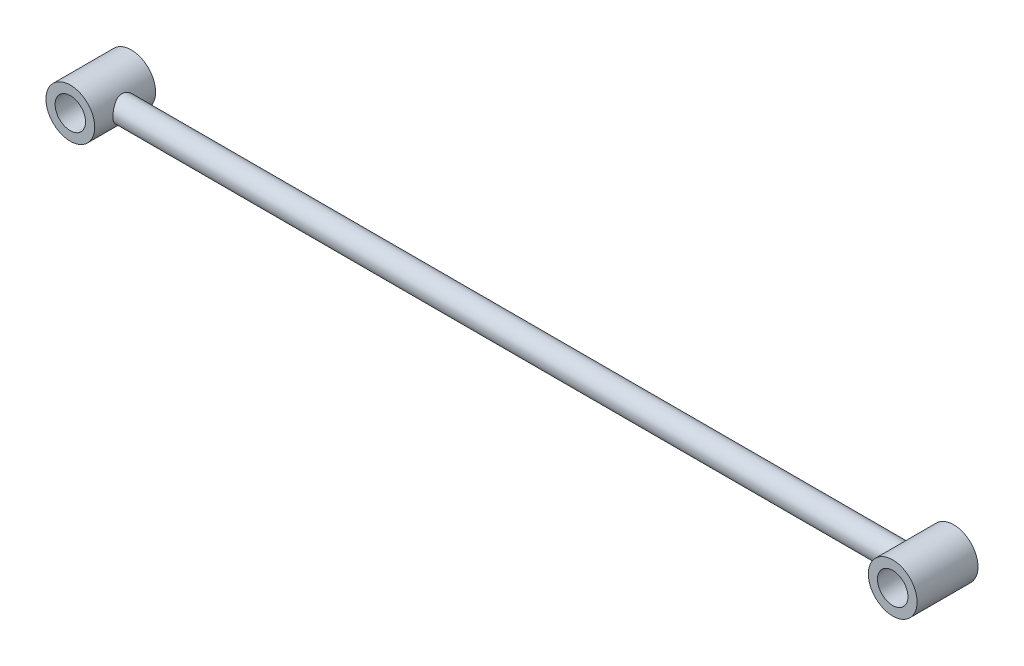
ISO-10303-21;
HEADER;
FILE_DESCRIPTION(('STEP AP214'),'2;1');
FILE_NAME('part.step','',(''),(''),'','','');
FILE_SCHEMA(('AUTOMOTIVE_DESIGN { 1 0 10303 214 1 1 1 1 }'));
ENDSEC;
DATA;
#1=APPLICATION_CONTEXT('core data for automotive mechanical design processes');
#2=APPLICATION_PROTOCOL_DEFINITION('international standard','automotive_design',2000,#1);
#3=PRODUCT_CONTEXT('',#1,'mechanical');
#4=PRODUCT('Part','Part','',(#3));
#5=PRODUCT_RELATED_PRODUCT_CATEGORY('part','',(#4));
#6=PRODUCT_DEFINITION_FORMATION('','',#4);
#7=PRODUCT_DEFINITION_CONTEXT('part definition',#1,'design');
#8=PRODUCT_DEFINITION('design','',#6,#7);
#9=PRODUCT_DEFINITION_SHAPE('','',#8);
#10=(LENGTH_UNIT() NAMED_UNIT(*) SI_UNIT(.MILLI.,.METRE.));
#11=(NAMED_UNIT(*) PLANE_ANGLE_UNIT() SI_UNIT($,.RADIAN.));
#12=(NAMED_UNIT(*) SI_UNIT($,.STERADIAN.) SOLID_ANGLE_UNIT());
#13=UNCERTAINTY_MEASURE_WITH_UNIT(LENGTH_MEASURE(1.E-05),#10,'distance_accuracy_value','');
#14=(GEOMETRIC_REPRESENTATION_CONTEXT(3) GLOBAL_UNCERTAINTY_ASSIGNED_CONTEXT((#13)) GLOBAL_UNIT_ASSIGNED_CONTEXT((#10,
#11,#12)) REPRESENTATION_CONTEXT('',''));
#15=CARTESIAN_POINT('',(0.,0.,0.));
#16=DIRECTION('',(0.,0.,1.));
#17=DIRECTION('',(1.,0.,0.));
#18=AXIS2_PLACEMENT_3D('',#15,#16,#17);
#19=CARTESIAN_POINT('',(0.,0.,-2.5));
#20=DIRECTION('',(0.,0.,1.));
#21=DIRECTION('',(1.,0.,0.));
#22=AXIS2_PLACEMENT_3D('',#19,#20,#21);
#23=CYLINDRICAL_SURFACE('',#22,2.);
#24=CARTESIAN_POINT('',(0.,0.,-2.5));
#25=DIRECTION('',(0.,0.,1.));
#26=DIRECTION('',(1.,0.,0.));
#27=AXIS2_PLACEMENT_3D('',#24,#25,#26);
#28=CIRCLE('',#27,2.);
#29=CARTESIAN_POINT('',(2.,0.,-2.5));
#30=VERTEX_POINT('',#29);
#31=EDGE_CURVE('E52',#30,#30,#28,.T.);
#32=ORIENTED_EDGE('',*,*,#31,.T.);
#33=EDGE_LOOP('',(#32));
#34=FACE_BOUND('',#33,.T.);
#35=CARTESIAN_POINT('',(0.,0.,2.5));
#36=DIRECTION('',(0.,0.,1.));
#37=DIRECTION('',(1.,0.,0.));
#38=AXIS2_PLACEMENT_3D('',#35,#36,#37);
#39=CIRCLE('',#38,2.);
#40=CARTESIAN_POINT('',(2.,0.,2.5));
#41=VERTEX_POINT('',#40);
#42=EDGE_CURVE('E93',#41,#41,#39,.T.);
#43=ORIENTED_EDGE('',*,*,#42,.F.);
#44=EDGE_LOOP('',(#43));
#45=FACE_BOUND('',#44,.T.);
#46=CARTESIAN_POINT('',(2.,0.,-0.999999999999989));
#47=CARTESIAN_POINT('',(1.99999713404151,-0.052571962952986,-0.999996697680488));
#48=CARTESIAN_POINT('',(1.99790491019518,-0.105206599698032,-0.995829926878314));
#49=CARTESIAN_POINT('',(1.98974156037396,-0.208920235268423,-0.979347119659071));
#50=CARTESIAN_POINT('',(1.98366287828984,-0.259996086713501,-0.967015607002339));
#51=CARTESIAN_POINT('',(1.96816279403312,-0.358933544880571,-0.934806191383195));
#52=CARTESIAN_POINT('',(1.9587543917752,-0.406806802939176,-0.914957615751977));
#53=CARTESIAN_POINT('',(1.93745776515779,-0.49847261680656,-0.868429378635049));
#54=CARTESIAN_POINT('',(1.9255697363353,-0.542265493990045,-0.841750255751138));
#55=CARTESIAN_POINT('',(1.89956258258057,-0.627507817761913,-0.780482750514692));
#56=CARTESIAN_POINT('',(1.88535199127536,-0.668655211122105,-0.745513520760349));
#57=CARTESIAN_POINT('',(1.85659970246745,-0.74477944486697,-0.669478520752958));
#58=CARTESIAN_POINT('',(1.84205776209035,-0.779751583106759,-0.628408148227551));
#59=CARTESIAN_POINT('',(1.81298951197347,-0.84525200045027,-0.53751665047661));
#60=CARTESIAN_POINT('',(1.79855186970132,-0.875225335551628,-0.48726390165408));
#61=CARTESIAN_POINT('',(1.77285978772321,-0.926168226890685,-0.38163266401378));
#62=CARTESIAN_POINT('',(1.7616030760699,-0.947144214966323,-0.326257871277246));
#63=CARTESIAN_POINT('',(1.74457867037809,-0.978132442188578,-0.215334894578074));
#64=CARTESIAN_POINT('',(1.73852271583714,-0.98872585708043,-0.159995547932603));
#65=CARTESIAN_POINT('',(1.73181889948528,-1.00042699330883,-0.0480211622205215));
#66=CARTESIAN_POINT('',(1.73116569343289,-1.00154408837306,0.00861254087115569));
#67=CARTESIAN_POINT('',(1.73510930257249,-0.994687287172283,0.114286024315368));
#68=CARTESIAN_POINT('',(1.73908763662014,-0.98778455953681,0.16342403122305));
#69=CARTESIAN_POINT('',(1.75076228733851,-0.966939849056921,0.259721909373041));
#70=CARTESIAN_POINT('',(1.75845978831777,-0.95299562389764,0.306881145305314));
#71=CARTESIAN_POINT('',(1.77687476412742,-0.918209780385993,0.399229132565657));
#72=CARTESIAN_POINT('',(1.78765840663999,-0.897215067115984,0.444346398785786));
#73=CARTESIAN_POINT('',(1.81103404281404,-0.849041687667991,0.530634292590004));
#74=CARTESIAN_POINT('',(1.82362684780191,-0.821860243812457,0.571803135600085));
#75=CARTESIAN_POINT('',(1.85113157903286,-0.758066054912778,0.654521252743221));
#76=CARTESIAN_POINT('',(1.86613510236747,-0.720694458369271,0.695456873576152));
#77=CARTESIAN_POINT('',(1.89547623300408,-0.639555578741363,0.770735418590895));
#78=CARTESIAN_POINT('',(1.90981351958801,-0.595785256574276,0.805075192033876));
#79=CARTESIAN_POINT('',(1.93701987282964,-0.50051650583184,0.867685661029719));
#80=CARTESIAN_POINT('',(1.94978984162008,-0.4487535915994,0.895600472445732));
#81=CARTESIAN_POINT('',(1.97157881121242,-0.34046621548879,0.942097029043));
#82=CARTESIAN_POINT('',(1.98060078943553,-0.28394557626527,0.960686185015157));
#83=CARTESIAN_POINT('',(1.99324333741436,-0.172766491660697,0.986475403716665));
#84=CARTESIAN_POINT('',(1.99724938301312,-0.11834153054832,0.994491235746767));
#85=CARTESIAN_POINT('',(2.00073013459102,-0.0087795999493507,1.00146473113448));
#86=CARTESIAN_POINT('',(2.00020698721312,0.0463570198699037,1.00042668563947));
#87=CARTESIAN_POINT('',(1.99491192253441,0.151232971985995,0.989793311581235));
#88=CARTESIAN_POINT('',(1.9904724568819,0.201059408049955,0.980867467269958));
#89=CARTESIAN_POINT('',(1.97822171314819,0.298406892301917,0.955761928104903));
#90=CARTESIAN_POINT('',(1.97041006334332,0.345927685690996,0.939581433546629));
#91=CARTESIAN_POINT('',(1.95184251413669,0.438888608449663,0.900001533566816));
#92=CARTESIAN_POINT('',(1.94100881769939,0.484230397006151,0.876408949883176));
#93=CARTESIAN_POINT('',(1.91743974317109,0.570461361698918,0.822892464353947));
#94=CARTESIAN_POINT('',(1.90470355565785,0.611348629775278,0.792965865406557));
#95=CARTESIAN_POINT('',(1.87708221337465,0.691767689290648,0.724239574667115));
#96=CARTESIAN_POINT('',(1.86210884848442,0.730772077824633,0.684857131546424));
#97=CARTESIAN_POINT('',(1.83262391603875,0.801856321113233,0.600074848730686));
#98=CARTESIAN_POINT('',(1.81811267381527,0.833931385690834,0.554670881183616));
#99=CARTESIAN_POINT('',(1.79051192226068,0.891707914497688,0.456356345799679));
#100=CARTESIAN_POINT('',(1.77752529663472,0.917025495878629,0.403188733791397));
#101=CARTESIAN_POINT('',(1.75574072368127,0.958082826013793,0.292489932307471));
#102=CARTESIAN_POINT('',(1.74693738240619,0.97383491588756,0.234964473498806));
#103=CARTESIAN_POINT('',(1.73561501008667,0.993861687449668,0.123089777138547));
#104=CARTESIAN_POINT('',(1.73257383460492,0.999092996400854,0.0689657465709596));
#105=CARTESIAN_POINT('',(1.73165354646176,1.00068915438078,-0.0394470671707315));
#106=CARTESIAN_POINT('',(1.73377219627553,0.997057846624387,-0.0937357687394361));
#107=CARTESIAN_POINT('',(1.74237862050025,0.981926125592251,-0.195483501532017));
#108=CARTESIAN_POINT('',(1.74843094482394,0.971208314342788,-0.243100470144401));
#109=CARTESIAN_POINT('',(1.76371016187918,0.943175358224633,-0.335808119424706));
#110=CARTESIAN_POINT('',(1.77293807569676,0.925858091159798,-0.380897982091967));
#111=CARTESIAN_POINT('',(1.79428530364529,0.883815745300671,-0.470624850986605));
#112=CARTESIAN_POINT('',(1.80655722396191,0.858671137816446,-0.515027901829699));
#113=CARTESIAN_POINT('',(1.83235331634591,0.802150971636622,-0.599274536180583));
#114=CARTESIAN_POINT('',(1.84587813794523,0.770772171238636,-0.639115730518487));
#115=CARTESIAN_POINT('',(1.87462323159313,0.698203326664629,-0.718141982357612));
#116=CARTESIAN_POINT('',(1.88984983311469,0.656284423010159,-0.756659102361917));
#117=CARTESIAN_POINT('',(1.91877752255088,0.566154806220268,-0.826262983423627));
#118=CARTESIAN_POINT('',(1.9324777860804,0.517940723256774,-0.857345739426283));
#119=CARTESIAN_POINT('',(1.95698009585103,0.415931596819936,-0.911236362762197));
#120=CARTESIAN_POINT('',(1.96776096562909,0.362099503934604,-0.933984169411426));
#121=CARTESIAN_POINT('',(1.98501341363466,0.250742101294182,-0.969808167918943));
#122=CARTESIAN_POINT('',(1.99149723372932,0.193227799623158,-0.982911846829568));
#123=CARTESIAN_POINT('',(1.99695461909663,0.112601946483377,-0.993897411075839));
#124=CARTESIAN_POINT('',(1.99809365339202,0.0901618794394935,-0.996182640863608));
#125=CARTESIAN_POINT('',(1.99961696977865,0.0451517318071549,-0.999234665516795));
#126=CARTESIAN_POINT('',(2.00000123103763,0.02258164764738,-1.00000141847119));
#127=CARTESIAN_POINT('',(2.,0.,-0.999999999999989));
#128=B_SPLINE_CURVE_WITH_KNOTS('',3,(#46,#47,#48,#49,#50,#51,#52,#53,#54,#55,#56,#57,#58,#59,
#60,#61,#62,#63,#64,#65,#66,#67,#68,#69,#70,#71,#72,#73,#74,#75,#76,#77,#78,#79,#80,#81,#82,#83,
#84,#85,#86,#87,#88,#89,#90,#91,#92,#93,#94,#95,#96,#97,#98,#99,#100,#101,#102,#103,#104,#105,
#106,#107,#108,#109,#110,#111,#112,#113,#114,#115,#116,#117,#118,#119,#120,#121,#122,#123,#124,
#125,#126,#127),.UNSPECIFIED.,.T.,.F.,(4,2,2,2,2,2,2,2,2,2,2,2,2,2,2,2,2,2,2,2,2,2,2,2,2,2,2,2,
2,2,2,2,2,2,2,2,2,2,2,2,4),(0.,0.157624257420291,0.315548149709194,0.472862155492294,
0.630163760581561,0.796981758718081,0.963926237654025,1.14381726430751,1.32357947898279,
1.49258012140228,1.66141357329019,1.81005712409319,1.95874803925676,2.11090240168485,
2.26312521260219,2.43464941333876,2.60625534598684,2.78583022214438,2.96526216912276,
3.12983290471342,3.29432564511472,3.44606906506118,3.59782921630928,3.75392856027895,
3.91009450748335,4.08159610644414,4.25321588615427,4.43314682159669,4.61284511940773,
4.77529307498368,4.9376705986,5.08457930244177,5.23153528783673,5.38836456775608,
5.54527561138952,5.72125242752492,5.89732383376567,6.07464013662919,6.25144908624923,
6.31915280137691,6.38685838514839),.UNSPECIFIED.);
#129=CARTESIAN_POINT('',(2.,0.,-0.999999999999989));
#130=VERTEX_POINT('',#129);
#131=EDGE_CURVE('E48',#130,#130,#128,.T.);
#132=ORIENTED_EDGE('',*,*,#131,.T.);
#133=EDGE_LOOP('',(#132));
#134=FACE_BOUND('',#133,.T.);
#135=ADVANCED_FACE('F36',(#34,#45,#134),#23,.T.);
#136=CARTESIAN_POINT('',(0.,0.,-2.5));
#137=DIRECTION('',(0.,0.,1.));
#138=DIRECTION('',(1.,0.,0.));
#139=AXIS2_PLACEMENT_3D('',#136,#137,#138);
#140=PLANE('',#139);
#141=CARTESIAN_POINT('',(0.,0.,-2.5));
#142=DIRECTION('',(0.,0.,1.));
#143=DIRECTION('',(1.,0.,0.));
#144=AXIS2_PLACEMENT_3D('',#141,#142,#143);
#145=CIRCLE('',#144,1.25);
#146=CARTESIAN_POINT('',(1.25,0.,-2.5));
#147=VERTEX_POINT('',#146);
#148=EDGE_CURVE('E56',#147,#147,#145,.T.);
#149=ORIENTED_EDGE('',*,*,#148,.T.);
#150=EDGE_LOOP('',(#149));
#151=FACE_BOUND('',#150,.T.);
#152=ORIENTED_EDGE('',*,*,#31,.F.);
#153=EDGE_LOOP('',(#152));
#154=FACE_BOUND('',#153,.T.);
#155=ADVANCED_FACE('F78',(#151,#154),#140,.F.);
#156=CARTESIAN_POINT('',(0.,0.,-2.5));
#157=DIRECTION('',(0.,0.,1.));
#158=DIRECTION('',(1.,0.,0.));
#159=AXIS2_PLACEMENT_3D('',#156,#157,#158);
#160=CYLINDRICAL_SURFACE('',#159,1.25);
#161=ORIENTED_EDGE('',*,*,#148,.F.);
#162=EDGE_LOOP('',(#161));
#163=FACE_BOUND('',#162,.T.);
#164=CARTESIAN_POINT('',(0.,0.,2.5));
#165=DIRECTION('',(0.,0.,1.));
#166=DIRECTION('',(1.,0.,0.));
#167=AXIS2_PLACEMENT_3D('',#164,#165,#166);
#168=CIRCLE('',#167,1.25);
#169=CARTESIAN_POINT('',(1.25,0.,2.5));
#170=VERTEX_POINT('',#169);
#171=EDGE_CURVE('E94',#170,#170,#168,.T.);
#172=ORIENTED_EDGE('',*,*,#171,.T.);
#173=EDGE_LOOP('',(#172));
#174=FACE_BOUND('',#173,.T.);
#175=ADVANCED_FACE('F75',(#163,#174),#160,.F.);
#176=CARTESIAN_POINT('',(0.,0.,2.5));
#177=DIRECTION('',(0.,0.,1.));
#178=DIRECTION('',(1.,0.,0.));
#179=AXIS2_PLACEMENT_3D('',#176,#177,#178);
#180=PLANE('',#179);
#181=ORIENTED_EDGE('',*,*,#42,.T.);
#182=EDGE_LOOP('',(#181));
#183=FACE_BOUND('',#182,.T.);
#184=ORIENTED_EDGE('',*,*,#171,.F.);
#185=EDGE_LOOP('',(#184));
#186=FACE_BOUND('',#185,.T.);
#187=ADVANCED_FACE('F68',(#183,#186),#180,.T.);
#188=CARTESIAN_POINT('',(2.,0.,0.));
#189=DIRECTION('',(-1.,0.,0.));
#190=DIRECTION('',(0.,0.,1.));
#191=AXIS2_PLACEMENT_3D('',#188,#189,#190);
#192=CYLINDRICAL_SURFACE('',#191,0.999999999999989);
#193=ORIENTED_EDGE('',*,*,#131,.F.);
#194=EDGE_LOOP('',(#193));
#195=FACE_BOUND('',#194,.T.);
#196=CARTESIAN_POINT('',(65.5,0.,0.999999999999989));
#197=CARTESIAN_POINT('',(65.5000028659585,0.0525719629529861,0.999996697680488));
#198=CARTESIAN_POINT('',(65.5020950898048,0.105206599698032,0.995829926878314));
#199=CARTESIAN_POINT('',(65.5102584396261,0.208920235268423,0.979347119659072));
#200=CARTESIAN_POINT('',(65.5163371217102,0.259996086713501,0.967015607002339));
#201=CARTESIAN_POINT('',(65.5318372059669,0.358933544880571,0.934806191383195));
#202=CARTESIAN_POINT('',(65.5412456082248,0.406806802939177,0.914957615751977));
#203=CARTESIAN_POINT('',(65.5625422348422,0.498472616806561,0.868429378635048));
#204=CARTESIAN_POINT('',(65.5744302636647,0.542265493990045,0.841750255751137));
#205=CARTESIAN_POINT('',(65.6004374174194,0.627507817761913,0.780482750514691));
#206=CARTESIAN_POINT('',(65.6146480087246,0.668655211122106,0.745513520760348));
#207=CARTESIAN_POINT('',(65.6434002975326,0.744779444866971,0.669478520752958));
#208=CARTESIAN_POINT('',(65.6579422379097,0.779751583106759,0.628408148227551));
#209=CARTESIAN_POINT('',(65.6870104880265,0.845252000450269,0.537516650476611));
#210=CARTESIAN_POINT('',(65.7014481302987,0.875225335551627,0.487263901654082));
#211=CARTESIAN_POINT('',(65.7271402122768,0.926168226890685,0.381632664013781));
#212=CARTESIAN_POINT('',(65.7383969239301,0.947144214966323,0.326257871277247));
#213=CARTESIAN_POINT('',(65.7554213296219,0.978132442188578,0.215334894578074));
#214=CARTESIAN_POINT('',(65.7614772841629,0.98872585708043,0.159995547932603));
#215=CARTESIAN_POINT('',(65.7681811005147,1.00042699330883,0.048021162220521));
#216=CARTESIAN_POINT('',(65.7688343065671,1.00154408837306,-0.008612540871157));
#217=CARTESIAN_POINT('',(65.7648906974275,0.994687287172283,-0.11428602431537));
#218=CARTESIAN_POINT('',(65.7609123633799,0.98778455953681,-0.163424031223051));
#219=CARTESIAN_POINT('',(65.7492377126615,0.966939849056921,-0.259721909373041));
#220=CARTESIAN_POINT('',(65.7415402116822,0.952995623897641,-0.306881145305314));
#221=CARTESIAN_POINT('',(65.7231252358726,0.918209780385993,-0.399229132565657));
#222=CARTESIAN_POINT('',(65.71234159336,0.897215067115983,-0.444346398785787));
#223=CARTESIAN_POINT('',(65.688965957186,0.84904168766799,-0.530634292590007));
#224=CARTESIAN_POINT('',(65.6763731521981,0.821860243812455,-0.571803135600087));
#225=CARTESIAN_POINT('',(65.6488684209671,0.758066054912776,-0.654521252743223));
#226=CARTESIAN_POINT('',(65.6338648976325,0.720694458369269,-0.695456873576154));
#227=CARTESIAN_POINT('',(65.6045237669959,0.639555578741362,-0.770735418590896));
#228=CARTESIAN_POINT('',(65.590186480412,0.595785256574276,-0.805075192033876));
#229=CARTESIAN_POINT('',(65.5629801271704,0.50051650583184,-0.867685661029719));
#230=CARTESIAN_POINT('',(65.5502101583799,0.448753591599401,-0.895600472445731));
#231=CARTESIAN_POINT('',(65.5284211887876,0.34046621548879,-0.942097029042999));
#232=CARTESIAN_POINT('',(65.5193992105645,0.283945576265271,-0.960686185015157));
#233=CARTESIAN_POINT('',(65.5067566625856,0.172766491660699,-0.986475403716665));
#234=CARTESIAN_POINT('',(65.5027506169869,0.118341530548321,-0.994491235746768));
#235=CARTESIAN_POINT('',(65.499269865409,0.00877959994935099,-1.00146473113448));
#236=CARTESIAN_POINT('',(65.4997930127869,-0.0463570198699039,-1.00042668563947));
#237=CARTESIAN_POINT('',(65.5050880774656,-0.151232971985995,-0.989793311581234));
#238=CARTESIAN_POINT('',(65.5095275431181,-0.201059408049955,-0.980867467269958));
#239=CARTESIAN_POINT('',(65.5217782868518,-0.298406892301916,-0.955761928104903));
#240=CARTESIAN_POINT('',(65.5295899366567,-0.345927685690996,-0.939581433546629));
#241=CARTESIAN_POINT('',(65.5481574858633,-0.438888608449664,-0.900001533566816));
#242=CARTESIAN_POINT('',(65.5589911823006,-0.484230397006151,-0.876408949883176));
#243=CARTESIAN_POINT('',(65.5825602568289,-0.570461361698917,-0.822892464353947));
#244=CARTESIAN_POINT('',(65.5952964443422,-0.611348629775278,-0.792965865406557));
#245=CARTESIAN_POINT('',(65.6229177866254,-0.69176768929065,-0.724239574667114));
#246=CARTESIAN_POINT('',(65.6378911515156,-0.730772077824637,-0.684857131546421));
#247=CARTESIAN_POINT('',(65.6673760839613,-0.801856321113235,-0.600074848730683));
#248=CARTESIAN_POINT('',(65.6818873261847,-0.833931385690834,-0.554670881183616));
#249=CARTESIAN_POINT('',(65.7094880777393,-0.891707914497687,-0.456356345799681));
#250=CARTESIAN_POINT('',(65.7224747033653,-0.917025495878629,-0.403188733791397));
#251=CARTESIAN_POINT('',(65.7442592763187,-0.958082826013793,-0.292489932307471));
#252=CARTESIAN_POINT('',(65.7530626175938,-0.97383491588756,-0.234964473498806));
#253=CARTESIAN_POINT('',(65.7643849899133,-0.993861687449668,-0.123089777138547));
#254=CARTESIAN_POINT('',(65.7674261653951,-0.999092996400854,-0.0689657465709599));
#255=CARTESIAN_POINT('',(65.7683464535383,-1.00068915438078,0.0394470671707311));
#256=CARTESIAN_POINT('',(65.7662278037245,-0.997057846624387,0.0937357687394356));
#257=CARTESIAN_POINT('',(65.7576213794998,-0.981926125592251,0.195483501532015));
#258=CARTESIAN_POINT('',(65.7515690551761,-0.971208314342788,0.243100470144399));
#259=CARTESIAN_POINT('',(65.7362898381208,-0.943175358224634,0.335808119424704));
#260=CARTESIAN_POINT('',(65.7270619243032,-0.925858091159798,0.380897982091966));
#261=CARTESIAN_POINT('',(65.7057146963547,-0.883815745300671,0.470624850986605));
#262=CARTESIAN_POINT('',(65.6934427760381,-0.858671137816448,0.515027901829697));
#263=CARTESIAN_POINT('',(65.6676466836541,-0.802150971636624,0.599274536180581));
#264=CARTESIAN_POINT('',(65.6541218620548,-0.770772171238636,0.639115730518487));
#265=CARTESIAN_POINT('',(65.6253767684069,-0.698203326664629,0.718141982357612));
#266=CARTESIAN_POINT('',(65.6101501668853,-0.656284423010161,0.756659102361916));
#267=CARTESIAN_POINT('',(65.5812224774491,-0.56615480622027,0.826262983423625));
#268=CARTESIAN_POINT('',(65.5675222139196,-0.517940723256775,0.857345739426282));
#269=CARTESIAN_POINT('',(65.543019904149,-0.415931596819939,0.911236362762196));
#270=CARTESIAN_POINT('',(65.5322390343709,-0.362099503934608,0.933984169411425));
#271=CARTESIAN_POINT('',(65.5149865863653,-0.250742101294187,0.969808167918941));
#272=CARTESIAN_POINT('',(65.5085027662707,-0.193227799623161,0.982911846829568));
#273=CARTESIAN_POINT('',(65.5030453809034,-0.112601946483379,0.993897411075839));
#274=CARTESIAN_POINT('',(65.501906346608,-0.0901618794394948,0.996182640863608));
#275=CARTESIAN_POINT('',(65.5003830302214,-0.0451517318071554,0.999234665516795));
#276=CARTESIAN_POINT('',(65.4999987689624,-0.0225816476473803,1.00000141847119));
#277=CARTESIAN_POINT('',(65.5,0.,0.999999999999989));
#278=B_SPLINE_CURVE_WITH_KNOTS('',3,(#196,#197,#198,#199,#200,#201,#202,#203,#204,#205,#206,
#207,#208,#209,#210,#211,#212,#213,#214,#215,#216,#217,#218,#219,#220,#221,#222,#223,#224,#225,
#226,#227,#228,#229,#230,#231,#232,#233,#234,#235,#236,#237,#238,#239,#240,#241,#242,#243,#244,
#245,#246,#247,#248,#249,#250,#251,#252,#253,#254,#255,#256,#257,#258,#259,#260,#261,#262,#263,
#264,#265,#266,#267,#268,#269,#270,#271,#272,#273,#274,#275,#276,#277),.UNSPECIFIED.,.T.,.F.,(4,
2,2,2,2,2,2,2,2,2,2,2,2,2,2,2,2,2,2,2,2,2,2,2,2,2,2,2,2,2,2,2,2,2,2,2,2,2,2,2,4),(0.,
0.157624257420292,0.315548149709194,0.472862155492295,0.630163760581562,0.796981758718082,
0.963926237654025,1.14381726430751,1.32357947898279,1.49258012140228,1.66141357329019,
1.81005712409319,1.95874803925676,2.11090240168485,2.2631252126022,2.43464941333876,
2.60625534598683,2.78583022214438,2.96526216912276,3.12983290471342,3.29432564511473,
3.44606906506118,3.59782921630928,3.75392856027895,3.91009450748335,4.08159610644415,
4.25321588615427,4.43314682159669,4.61284511940773,4.77529307498368,4.9376705986,
5.08457930244177,5.23153528783672,5.38836456775608,5.54527561138952,5.72125242752493,
5.89732383376566,6.07464013662918,6.25144908624923,6.31915280137691,6.3868583851484),.UNSPECIFIED.);
#279=CARTESIAN_POINT('',(65.5,0.,0.999999999999989));
#280=VERTEX_POINT('',#279);
#281=EDGE_CURVE('E10',#280,#280,#278,.T.);
#282=ORIENTED_EDGE('',*,*,#281,.T.);
#283=EDGE_LOOP('',(#282));
#284=FACE_BOUND('',#283,.T.);
#285=ADVANCED_FACE('F62',(#195,#284),#192,.T.);
#286=CARTESIAN_POINT('',(67.5,0.,-2.5));
#287=DIRECTION('',(0.,0.,1.));
#288=DIRECTION('',(1.,0.,0.));
#289=AXIS2_PLACEMENT_3D('',#286,#287,#288);
#290=CYLINDRICAL_SURFACE('',#289,2.);
#291=CARTESIAN_POINT('',(67.5,0.,2.5));
#292=DIRECTION('',(0.,0.,1.));
#293=DIRECTION('',(1.,0.,0.));
#294=AXIS2_PLACEMENT_3D('',#291,#292,#293);
#295=CIRCLE('',#294,2.);
#296=CARTESIAN_POINT('',(69.5,0.,2.5));
#297=VERTEX_POINT('',#296);
#298=EDGE_CURVE('E102',#297,#297,#295,.T.);
#299=ORIENTED_EDGE('',*,*,#298,.F.);
#300=EDGE_LOOP('',(#299));
#301=FACE_BOUND('',#300,.T.);
#302=CARTESIAN_POINT('',(67.5,0.,-2.5));
#303=DIRECTION('',(0.,0.,1.));
#304=DIRECTION('',(1.,0.,0.));
#305=AXIS2_PLACEMENT_3D('',#302,#303,#304);
#306=CIRCLE('',#305,2.);
#307=CARTESIAN_POINT('',(69.5,0.,-2.5));
#308=VERTEX_POINT('',#307);
#309=EDGE_CURVE('E108',#308,#308,#306,.T.);
#310=ORIENTED_EDGE('',*,*,#309,.T.);
#311=EDGE_LOOP('',(#310));
#312=FACE_BOUND('',#311,.T.);
#313=ORIENTED_EDGE('',*,*,#281,.F.);
#314=EDGE_LOOP('',(#313));
#315=FACE_BOUND('',#314,.T.);
#316=ADVANCED_FACE('F67',(#301,#312,#315),#290,.T.);
#317=CARTESIAN_POINT('',(67.5,0.,-2.5));
#318=DIRECTION('',(0.,0.,1.));
#319=DIRECTION('',(1.,0.,0.));
#320=AXIS2_PLACEMENT_3D('',#317,#318,#319);
#321=PLANE('',#320);
#322=CARTESIAN_POINT('',(67.5,0.,-2.5));
#323=DIRECTION('',(0.,0.,1.));
#324=DIRECTION('',(1.,0.,0.));
#325=AXIS2_PLACEMENT_3D('',#322,#323,#324);
#326=CIRCLE('',#325,1.25);
#327=CARTESIAN_POINT('',(68.75,0.,-2.5));
#328=VERTEX_POINT('',#327);
#329=EDGE_CURVE('E105',#328,#328,#326,.T.);
#330=ORIENTED_EDGE('',*,*,#329,.T.);
#331=EDGE_LOOP('',(#330));
#332=FACE_BOUND('',#331,.T.);
#333=ORIENTED_EDGE('',*,*,#309,.F.);
#334=EDGE_LOOP('',(#333));
#335=FACE_BOUND('',#334,.T.);
#336=ADVANCED_FACE('F114',(#332,#335),#321,.F.);
#337=CARTESIAN_POINT('',(67.5,0.,-2.5));
#338=DIRECTION('',(0.,0.,1.));
#339=DIRECTION('',(1.,0.,0.));
#340=AXIS2_PLACEMENT_3D('',#337,#338,#339);
#341=CYLINDRICAL_SURFACE('',#340,1.25);
#342=ORIENTED_EDGE('',*,*,#329,.F.);
#343=EDGE_LOOP('',(#342));
#344=FACE_BOUND('',#343,.T.);
#345=CARTESIAN_POINT('',(67.5,0.,2.5));
#346=DIRECTION('',(0.,0.,1.));
#347=DIRECTION('',(1.,0.,0.));
#348=AXIS2_PLACEMENT_3D('',#345,#346,#347);
#349=CIRCLE('',#348,1.25);
#350=CARTESIAN_POINT('',(68.75,0.,2.5));
#351=VERTEX_POINT('',#350);
#352=EDGE_CURVE('E97',#351,#351,#349,.T.);
#353=ORIENTED_EDGE('',*,*,#352,.T.);
#354=EDGE_LOOP('',(#353));
#355=FACE_BOUND('',#354,.T.);
#356=ADVANCED_FACE('F116',(#344,#355),#341,.F.);
#357=CARTESIAN_POINT('',(67.5,0.,2.5));
#358=DIRECTION('',(0.,0.,1.));
#359=DIRECTION('',(1.,0.,0.));
#360=AXIS2_PLACEMENT_3D('',#357,#358,#359);
#361=PLANE('',#360);
#362=ORIENTED_EDGE('',*,*,#298,.T.);
#363=EDGE_LOOP('',(#362));
#364=FACE_BOUND('',#363,.T.);
#365=ORIENTED_EDGE('',*,*,#352,.F.);
#366=EDGE_LOOP('',(#365));
#367=FACE_BOUND('',#366,.T.);
#368=ADVANCED_FACE('F70',(#364,#367),#361,.T.);
#369=CLOSED_SHELL('',(#135,#155,#175,#187,#285,#316,#336,#356,#368));
#370=MANIFOLD_SOLID_BREP('B2',#369);
#371=ADVANCED_BREP_SHAPE_REPRESENTATION('',(#18,#370),#14);
#372=SHAPE_DEFINITION_REPRESENTATION(#9,#371);
ENDSEC;
END-ISO-10303-21;
